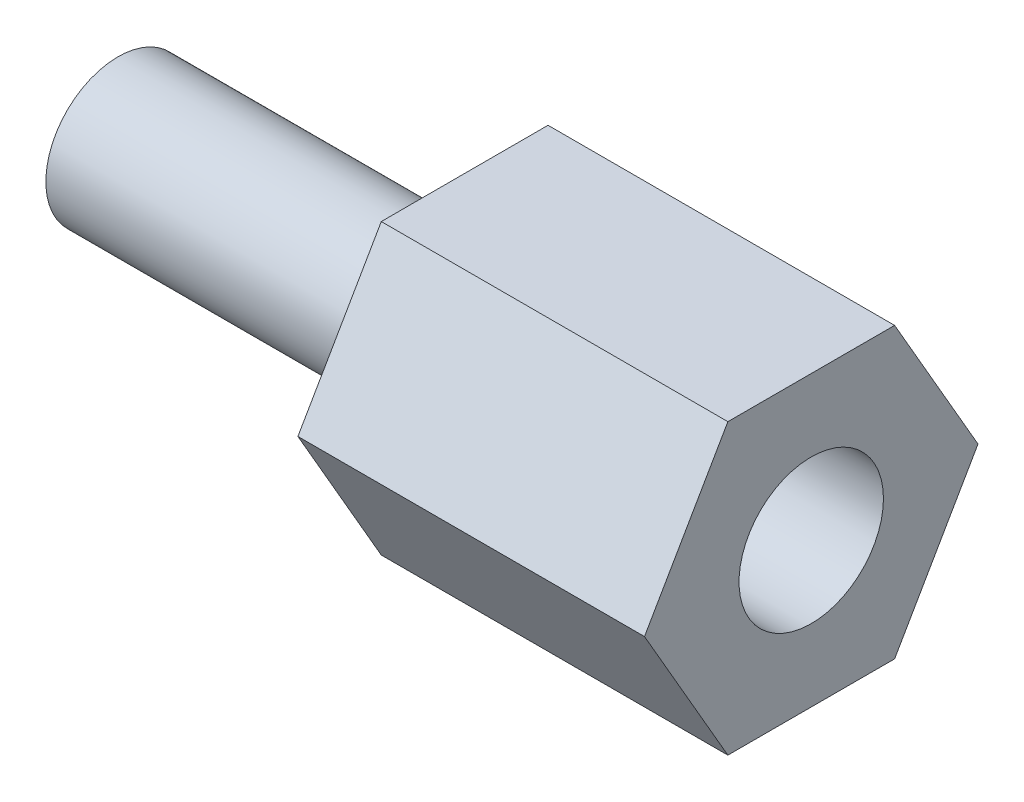
ISO-10303-21;
HEADER;
FILE_DESCRIPTION(('STEP AP214'),'2;1');
FILE_NAME('part.step','',(''),(''),'','','');
FILE_SCHEMA(('AUTOMOTIVE_DESIGN { 1 0 10303 214 1 1 1 1 }'));
ENDSEC;
DATA;
#1=APPLICATION_CONTEXT('core data for automotive mechanical design processes');
#2=APPLICATION_PROTOCOL_DEFINITION('international standard','automotive_design',2000,#1);
#3=PRODUCT_CONTEXT('',#1,'mechanical');
#4=PRODUCT('Part','Part','',(#3));
#5=PRODUCT_RELATED_PRODUCT_CATEGORY('part','',(#4));
#6=PRODUCT_DEFINITION_FORMATION('','',#4);
#7=PRODUCT_DEFINITION_CONTEXT('part definition',#1,'design');
#8=PRODUCT_DEFINITION('design','',#6,#7);
#9=PRODUCT_DEFINITION_SHAPE('','',#8);
#10=(LENGTH_UNIT() NAMED_UNIT(*) SI_UNIT(.MILLI.,.METRE.));
#11=(NAMED_UNIT(*) PLANE_ANGLE_UNIT() SI_UNIT($,.RADIAN.));
#12=(NAMED_UNIT(*) SI_UNIT($,.STERADIAN.) SOLID_ANGLE_UNIT());
#13=UNCERTAINTY_MEASURE_WITH_UNIT(LENGTH_MEASURE(1.E-05),#10,'distance_accuracy_value','');
#14=(GEOMETRIC_REPRESENTATION_CONTEXT(3) GLOBAL_UNCERTAINTY_ASSIGNED_CONTEXT((#13)) GLOBAL_UNIT_ASSIGNED_CONTEXT((#10,
#11,#12)) REPRESENTATION_CONTEXT('',''));
#15=CARTESIAN_POINT('',(0.,0.,0.));
#16=DIRECTION('',(0.,0.,1.));
#17=DIRECTION('',(1.,0.,0.));
#18=AXIS2_PLACEMENT_3D('',#15,#16,#17);
#19=CARTESIAN_POINT('',(6.,0.,0.));
#20=DIRECTION('',(1.,0.,0.));
#21=DIRECTION('',(0.,0.,-1.));
#22=AXIS2_PLACEMENT_3D('',#19,#20,#21);
#23=PLANE('',#22);
#24=DIRECTION('',(0.,0.866025403784439,-0.499999999999999));
#25=VECTOR('',#24,1.);
#26=CARTESIAN_POINT('',(6.,-2.5,-1.44337567297406));
#27=LINE('',#26,#25);
#28=CARTESIAN_POINT('',(6.,-2.5,-1.44337567297406));
#29=VERTEX_POINT('',#28);
#30=CARTESIAN_POINT('',(6.,0.,-2.88675134594813));
#31=VERTEX_POINT('',#30);
#32=EDGE_CURVE('E171',#29,#31,#27,.T.);
#33=ORIENTED_EDGE('',*,*,#32,.T.);
#34=DIRECTION('',(0.,0.866025403784438,0.500000000000001));
#35=VECTOR('',#34,1.);
#36=CARTESIAN_POINT('',(6.,0.,-2.88675134594813));
#37=LINE('',#36,#35);
#38=CARTESIAN_POINT('',(6.,2.5,-1.44337567297406));
#39=VERTEX_POINT('',#38);
#40=EDGE_CURVE('E119',#31,#39,#37,.T.);
#41=ORIENTED_EDGE('',*,*,#40,.T.);
#42=DIRECTION('',(0.,0.,1.));
#43=VECTOR('',#42,1.);
#44=CARTESIAN_POINT('',(6.,2.5,-1.44337567297406));
#45=LINE('',#44,#43);
#46=CARTESIAN_POINT('',(6.,2.5,1.44337567297406));
#47=VERTEX_POINT('',#46);
#48=EDGE_CURVE('E132',#39,#47,#45,.T.);
#49=ORIENTED_EDGE('',*,*,#48,.T.);
#50=DIRECTION('',(0.,-0.866025403784439,0.5));
#51=VECTOR('',#50,1.);
#52=CARTESIAN_POINT('',(6.,2.5,1.44337567297406));
#53=LINE('',#52,#51);
#54=CARTESIAN_POINT('',(6.,0.,2.88675134594813));
#55=VERTEX_POINT('',#54);
#56=EDGE_CURVE('E126',#47,#55,#53,.T.);
#57=ORIENTED_EDGE('',*,*,#56,.T.);
#58=DIRECTION('',(0.,-0.866025403784439,-0.5));
#59=VECTOR('',#58,1.);
#60=CARTESIAN_POINT('',(6.,0.,2.88675134594813));
#61=LINE('',#60,#59);
#62=CARTESIAN_POINT('',(6.,-2.5,1.44337567297406));
#63=VERTEX_POINT('',#62);
#64=EDGE_CURVE('E130',#55,#63,#61,.T.);
#65=ORIENTED_EDGE('',*,*,#64,.T.);
#66=DIRECTION('',(0.,0.,-1.));
#67=VECTOR('',#66,1.);
#68=CARTESIAN_POINT('',(6.,-2.5,1.44337567297406));
#69=LINE('',#68,#67);
#70=EDGE_CURVE('E75',#63,#29,#69,.T.);
#71=ORIENTED_EDGE('',*,*,#70,.T.);
#72=EDGE_LOOP('',(#33,#41,#49,#57,#65,#71));
#73=FACE_BOUND('',#72,.T.);
#74=CARTESIAN_POINT('',(6.,0.,0.));
#75=DIRECTION('',(1.,0.,0.));
#76=DIRECTION('',(0.,0.,-1.));
#77=AXIS2_PLACEMENT_3D('',#74,#75,#76);
#78=CIRCLE('',#77,1.25);
#79=CARTESIAN_POINT('',(6.,0.,-1.25));
#80=VERTEX_POINT('',#79);
#81=EDGE_CURVE('E159',#80,#80,#78,.T.);
#82=ORIENTED_EDGE('',*,*,#81,.F.);
#83=EDGE_LOOP('',(#82));
#84=FACE_BOUND('',#83,.T.);
#85=ADVANCED_FACE('F55',(#73,#84),#23,.T.);
#86=CARTESIAN_POINT('',(0.,0.,0.));
#87=DIRECTION('',(1.,0.,0.));
#88=DIRECTION('',(0.,0.,-1.));
#89=AXIS2_PLACEMENT_3D('',#86,#87,#88);
#90=PLANE('',#89);
#91=DIRECTION('',(0.,0.866025403784439,-0.499999999999999));
#92=VECTOR('',#91,1.);
#93=CARTESIAN_POINT('',(0.,-2.5,-1.44337567297406));
#94=LINE('',#93,#92);
#95=CARTESIAN_POINT('',(0.,-2.5,-1.44337567297406));
#96=VERTEX_POINT('',#95);
#97=CARTESIAN_POINT('',(0.,0.,-2.88675134594813));
#98=VERTEX_POINT('',#97);
#99=EDGE_CURVE('E154',#96,#98,#94,.T.);
#100=ORIENTED_EDGE('',*,*,#99,.F.);
#101=DIRECTION('',(0.,0.,-1.));
#102=VECTOR('',#101,1.);
#103=CARTESIAN_POINT('',(0.,-2.5,1.44337567297406));
#104=LINE('',#103,#102);
#105=CARTESIAN_POINT('',(0.,-2.5,1.44337567297406));
#106=VERTEX_POINT('',#105);
#107=EDGE_CURVE('E111',#106,#96,#104,.T.);
#108=ORIENTED_EDGE('',*,*,#107,.F.);
#109=DIRECTION('',(0.,-0.866025403784439,-0.5));
#110=VECTOR('',#109,1.);
#111=CARTESIAN_POINT('',(0.,0.,2.88675134594813));
#112=LINE('',#111,#110);
#113=CARTESIAN_POINT('',(0.,0.,2.88675134594813));
#114=VERTEX_POINT('',#113);
#115=EDGE_CURVE('E105',#114,#106,#112,.T.);
#116=ORIENTED_EDGE('',*,*,#115,.F.);
#117=DIRECTION('',(0.,-0.866025403784439,0.5));
#118=VECTOR('',#117,1.);
#119=CARTESIAN_POINT('',(0.,2.5,1.44337567297406));
#120=LINE('',#119,#118);
#121=CARTESIAN_POINT('',(0.,2.5,1.44337567297406));
#122=VERTEX_POINT('',#121);
#123=EDGE_CURVE('E141',#122,#114,#120,.T.);
#124=ORIENTED_EDGE('',*,*,#123,.F.);
#125=DIRECTION('',(0.,0.,1.));
#126=VECTOR('',#125,1.);
#127=CARTESIAN_POINT('',(0.,2.5,-1.44337567297406));
#128=LINE('',#127,#126);
#129=CARTESIAN_POINT('',(0.,2.5,-1.44337567297406));
#130=VERTEX_POINT('',#129);
#131=EDGE_CURVE('E162',#130,#122,#128,.T.);
#132=ORIENTED_EDGE('',*,*,#131,.F.);
#133=DIRECTION('',(0.,0.866025403784438,0.500000000000001));
#134=VECTOR('',#133,1.);
#135=CARTESIAN_POINT('',(0.,0.,-2.88675134594813));
#136=LINE('',#135,#134);
#137=EDGE_CURVE('E158',#98,#130,#136,.T.);
#138=ORIENTED_EDGE('',*,*,#137,.F.);
#139=EDGE_LOOP('',(#100,#108,#116,#124,#132,#138));
#140=FACE_BOUND('',#139,.T.);
#141=CARTESIAN_POINT('',(0.,0.,0.));
#142=DIRECTION('',(1.,0.,0.));
#143=DIRECTION('',(0.,0.,-1.));
#144=AXIS2_PLACEMENT_3D('',#141,#142,#143);
#145=CIRCLE('',#144,1.25);
#146=CARTESIAN_POINT('',(0.,0.,-1.25));
#147=VERTEX_POINT('',#146);
#148=EDGE_CURVE('E293',#147,#147,#145,.T.);
#149=ORIENTED_EDGE('',*,*,#148,.T.);
#150=EDGE_LOOP('',(#149));
#151=FACE_BOUND('',#150,.T.);
#152=ADVANCED_FACE('F184',(#140,#151),#90,.F.);
#153=CARTESIAN_POINT('',(6.,-2.5,-1.44337567297406));
#154=DIRECTION('',(0.,0.5,0.866025403784439));
#155=DIRECTION('',(0.,-0.866025403784439,0.5));
#156=AXIS2_PLACEMENT_3D('',#153,#154,#155);
#157=PLANE('',#156);
#158=ORIENTED_EDGE('',*,*,#99,.T.);
#159=DIRECTION('',(-1.,0.,0.));
#160=VECTOR('',#159,1.);
#161=CARTESIAN_POINT('',(6.,0.,-2.88675134594813));
#162=LINE('',#161,#160);
#163=EDGE_CURVE('E12',#31,#98,#162,.T.);
#164=ORIENTED_EDGE('',*,*,#163,.F.);
#165=ORIENTED_EDGE('',*,*,#32,.F.);
#166=DIRECTION('',(-1.,0.,0.));
#167=VECTOR('',#166,1.);
#168=CARTESIAN_POINT('',(6.,-2.5,-1.44337567297406));
#169=LINE('',#168,#167);
#170=EDGE_CURVE('E150',#29,#96,#169,.T.);
#171=ORIENTED_EDGE('',*,*,#170,.T.);
#172=EDGE_LOOP('',(#158,#164,#165,#171));
#173=FACE_BOUND('',#172,.T.);
#174=ADVANCED_FACE('F57',(#173),#157,.F.);
#175=CARTESIAN_POINT('',(6.,0.,-2.88675134594813));
#176=DIRECTION('',(0.,-0.5,0.866025403784438));
#177=DIRECTION('',(0.,-0.866025403784438,-0.500000000000001));
#178=AXIS2_PLACEMENT_3D('',#175,#176,#177);
#179=PLANE('',#178);
#180=ORIENTED_EDGE('',*,*,#137,.T.);
#181=DIRECTION('',(-1.,0.,0.));
#182=VECTOR('',#181,1.);
#183=CARTESIAN_POINT('',(6.,2.5,-1.44337567297406));
#184=LINE('',#183,#182);
#185=EDGE_CURVE('E65',#39,#130,#184,.T.);
#186=ORIENTED_EDGE('',*,*,#185,.F.);
#187=ORIENTED_EDGE('',*,*,#40,.F.);
#188=ORIENTED_EDGE('',*,*,#163,.T.);
#189=EDGE_LOOP('',(#180,#186,#187,#188));
#190=FACE_BOUND('',#189,.T.);
#191=ADVANCED_FACE('F209',(#190),#179,.F.);
#192=CARTESIAN_POINT('',(6.,2.5,-1.44337567297406));
#193=DIRECTION('',(0.,-1.,0.));
#194=DIRECTION('',(0.,0.,-1.));
#195=AXIS2_PLACEMENT_3D('',#192,#193,#194);
#196=PLANE('',#195);
#197=ORIENTED_EDGE('',*,*,#131,.T.);
#198=DIRECTION('',(-1.,0.,0.));
#199=VECTOR('',#198,1.);
#200=CARTESIAN_POINT('',(6.,2.5,1.44337567297406));
#201=LINE('',#200,#199);
#202=EDGE_CURVE('E143',#47,#122,#201,.T.);
#203=ORIENTED_EDGE('',*,*,#202,.F.);
#204=ORIENTED_EDGE('',*,*,#48,.F.);
#205=ORIENTED_EDGE('',*,*,#185,.T.);
#206=EDGE_LOOP('',(#197,#203,#204,#205));
#207=FACE_BOUND('',#206,.T.);
#208=ADVANCED_FACE('F181',(#207),#196,.F.);
#209=CARTESIAN_POINT('',(6.,2.5,1.44337567297406));
#210=DIRECTION('',(0.,-0.5,-0.866025403784439));
#211=DIRECTION('',(0.,0.866025403784439,-0.5));
#212=AXIS2_PLACEMENT_3D('',#209,#210,#211);
#213=PLANE('',#212);
#214=ORIENTED_EDGE('',*,*,#123,.T.);
#215=DIRECTION('',(-1.,0.,0.));
#216=VECTOR('',#215,1.);
#217=CARTESIAN_POINT('',(6.,0.,2.88675134594813));
#218=LINE('',#217,#216);
#219=EDGE_CURVE('E138',#55,#114,#218,.T.);
#220=ORIENTED_EDGE('',*,*,#219,.F.);
#221=ORIENTED_EDGE('',*,*,#56,.F.);
#222=ORIENTED_EDGE('',*,*,#202,.T.);
#223=EDGE_LOOP('',(#214,#220,#221,#222));
#224=FACE_BOUND('',#223,.T.);
#225=ADVANCED_FACE('F139',(#224),#213,.F.);
#226=CARTESIAN_POINT('',(6.,0.,2.88675134594813));
#227=DIRECTION('',(0.,0.5,-0.866025403784439));
#228=DIRECTION('',(0.,0.866025403784439,0.5));
#229=AXIS2_PLACEMENT_3D('',#226,#227,#228);
#230=PLANE('',#229);
#231=ORIENTED_EDGE('',*,*,#115,.T.);
#232=DIRECTION('',(-1.,0.,0.));
#233=VECTOR('',#232,1.);
#234=CARTESIAN_POINT('',(6.,-2.5,1.44337567297406));
#235=LINE('',#234,#233);
#236=EDGE_CURVE('E144',#63,#106,#235,.T.);
#237=ORIENTED_EDGE('',*,*,#236,.F.);
#238=ORIENTED_EDGE('',*,*,#64,.F.);
#239=ORIENTED_EDGE('',*,*,#219,.T.);
#240=EDGE_LOOP('',(#231,#237,#238,#239));
#241=FACE_BOUND('',#240,.T.);
#242=ADVANCED_FACE('F146',(#241),#230,.F.);
#243=CARTESIAN_POINT('',(6.,-2.5,1.44337567297406));
#244=DIRECTION('',(0.,1.,0.));
#245=DIRECTION('',(0.,0.,1.));
#246=AXIS2_PLACEMENT_3D('',#243,#244,#245);
#247=PLANE('',#246);
#248=ORIENTED_EDGE('',*,*,#107,.T.);
#249=ORIENTED_EDGE('',*,*,#170,.F.);
#250=ORIENTED_EDGE('',*,*,#70,.F.);
#251=ORIENTED_EDGE('',*,*,#236,.T.);
#252=EDGE_LOOP('',(#248,#249,#250,#251));
#253=FACE_BOUND('',#252,.T.);
#254=ADVANCED_FACE('F189',(#253),#247,.F.);
#255=CARTESIAN_POINT('',(6.,0.,0.));
#256=DIRECTION('',(-1.,0.,0.));
#257=DIRECTION('',(0.,0.,1.));
#258=AXIS2_PLACEMENT_3D('',#255,#256,#257);
#259=CYLINDRICAL_SURFACE('',#258,1.25);
#260=ORIENTED_EDGE('',*,*,#81,.T.);
#261=EDGE_LOOP('',(#260));
#262=FACE_BOUND('',#261,.T.);
#263=ORIENTED_EDGE('',*,*,#148,.F.);
#264=EDGE_LOOP('',(#263));
#265=FACE_BOUND('',#264,.T.);
#266=ADVANCED_FACE('F191',(#262,#265),#259,.F.);
#267=CLOSED_SHELL('',(#85,#152,#174,#191,#208,#225,#242,#254,#266));
#268=MANIFOLD_SOLID_BREP('B2',#267);
#269=CARTESIAN_POINT('',(-6.,0.,0.));
#270=DIRECTION('',(1.,0.,0.));
#271=DIRECTION('',(0.,0.,-1.));
#272=AXIS2_PLACEMENT_3D('',#269,#270,#271);
#273=CYLINDRICAL_SURFACE('',#272,1.25);
#274=CARTESIAN_POINT('',(-6.,0.,0.));
#275=DIRECTION('',(1.,0.,0.));
#276=DIRECTION('',(0.,0.,-1.));
#277=AXIS2_PLACEMENT_3D('',#274,#275,#276);
#278=CIRCLE('',#277,1.25);
#279=CARTESIAN_POINT('',(-6.,0.,-1.25));
#280=VERTEX_POINT('',#279);
#281=EDGE_CURVE('E54',#280,#280,#278,.T.);
#282=ORIENTED_EDGE('',*,*,#281,.T.);
#283=EDGE_LOOP('',(#282));
#284=FACE_BOUND('',#283,.T.);
#285=CARTESIAN_POINT('',(0.,0.,0.));
#286=DIRECTION('',(1.,0.,0.));
#287=DIRECTION('',(0.,0.,-1.));
#288=AXIS2_PLACEMENT_3D('',#285,#286,#287);
#289=CIRCLE('',#288,1.25);
#290=CARTESIAN_POINT('',(0.,0.,-1.25));
#291=VERTEX_POINT('',#290);
#292=EDGE_CURVE('E309',#291,#291,#289,.T.);
#293=ORIENTED_EDGE('',*,*,#292,.F.);
#294=EDGE_LOOP('',(#293));
#295=FACE_BOUND('',#294,.T.);
#296=ADVANCED_FACE('F306',(#284,#295),#273,.T.);
#297=CARTESIAN_POINT('',(-6.,0.,0.));
#298=DIRECTION('',(1.,0.,0.));
#299=DIRECTION('',(0.,0.,-1.));
#300=AXIS2_PLACEMENT_3D('',#297,#298,#299);
#301=PLANE('',#300);
#302=ORIENTED_EDGE('',*,*,#281,.F.);
#303=EDGE_LOOP('',(#302));
#304=FACE_BOUND('',#303,.T.);
#305=ADVANCED_FACE('F322',(#304),#301,.F.);
#306=CARTESIAN_POINT('',(0.,0.,0.));
#307=DIRECTION('',(1.,0.,0.));
#308=DIRECTION('',(0.,0.,-1.));
#309=AXIS2_PLACEMENT_3D('',#306,#307,#308);
#310=PLANE('',#309);
#311=ORIENTED_EDGE('',*,*,#292,.T.);
#312=EDGE_LOOP('',(#311));
#313=FACE_BOUND('',#312,.T.);
#314=ADVANCED_FACE('F319',(#313),#310,.T.);
#315=CLOSED_SHELL('',(#296,#305,#314));
#316=MANIFOLD_SOLID_BREP('B6',#315);
#317=ADVANCED_BREP_SHAPE_REPRESENTATION('',(#18,#268,#316),#14);
#318=SHAPE_DEFINITION_REPRESENTATION(#9,#317);
ENDSEC;
END-ISO-10303-21;
